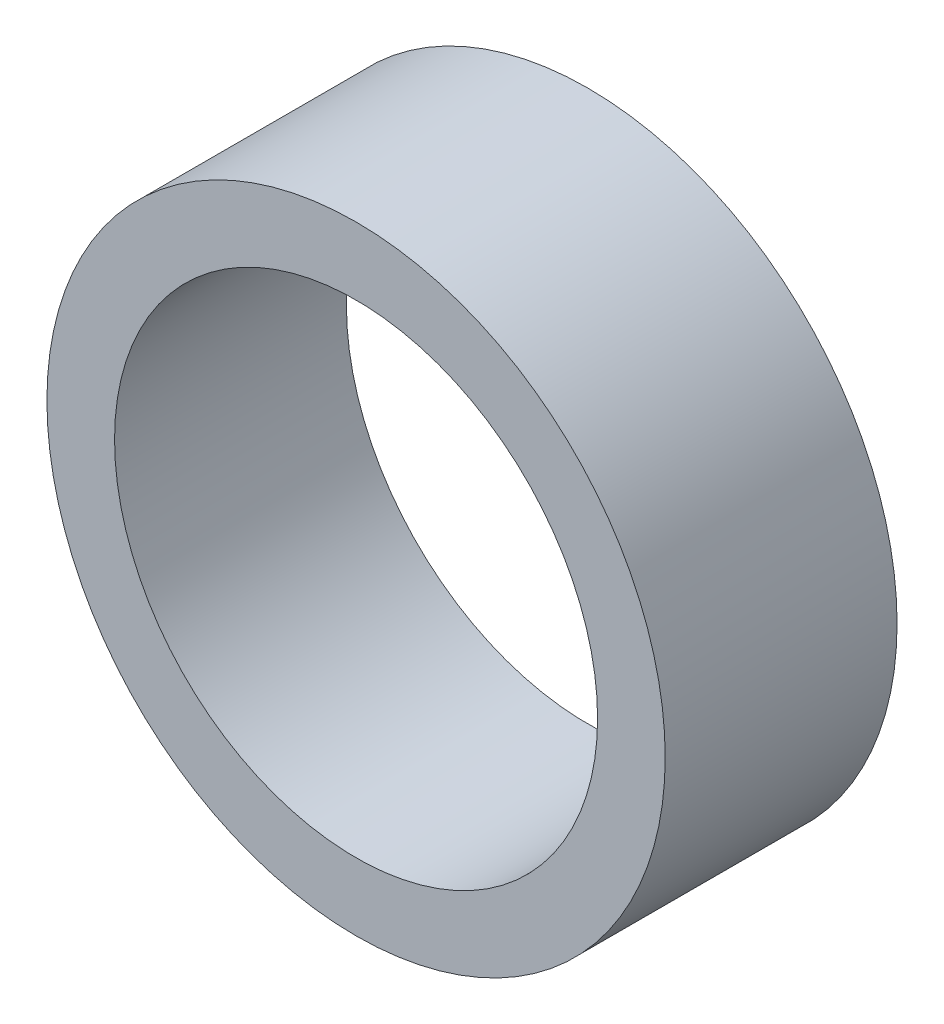
ISO-10303-21;
HEADER;
FILE_DESCRIPTION(('STEP AP214'),'2;1');
FILE_NAME('part.step','',(''),(''),'','','');
FILE_SCHEMA(('AUTOMOTIVE_DESIGN { 1 0 10303 214 1 1 1 1 }'));
ENDSEC;
DATA;
#1=APPLICATION_CONTEXT('core data for automotive mechanical design processes');
#2=APPLICATION_PROTOCOL_DEFINITION('international standard','automotive_design',2000,#1);
#3=PRODUCT_CONTEXT('',#1,'mechanical');
#4=PRODUCT('Part','Part','',(#3));
#5=PRODUCT_RELATED_PRODUCT_CATEGORY('part','',(#4));
#6=PRODUCT_DEFINITION_FORMATION('','',#4);
#7=PRODUCT_DEFINITION_CONTEXT('part definition',#1,'design');
#8=PRODUCT_DEFINITION('design','',#6,#7);
#9=PRODUCT_DEFINITION_SHAPE('','',#8);
#10=(LENGTH_UNIT() NAMED_UNIT(*) SI_UNIT(.MILLI.,.METRE.));
#11=(NAMED_UNIT(*) PLANE_ANGLE_UNIT() SI_UNIT($,.RADIAN.));
#12=(NAMED_UNIT(*) SI_UNIT($,.STERADIAN.) SOLID_ANGLE_UNIT());
#13=UNCERTAINTY_MEASURE_WITH_UNIT(LENGTH_MEASURE(1.E-05),#10,'distance_accuracy_value','');
#14=(GEOMETRIC_REPRESENTATION_CONTEXT(3) GLOBAL_UNCERTAINTY_ASSIGNED_CONTEXT((#13)) GLOBAL_UNIT_ASSIGNED_CONTEXT((#10,
#11,#12)) REPRESENTATION_CONTEXT('',''));
#15=CARTESIAN_POINT('',(0.,0.,0.));
#16=DIRECTION('',(0.,0.,1.));
#17=DIRECTION('',(1.,0.,0.));
#18=AXIS2_PLACEMENT_3D('',#15,#16,#17);
#19=CARTESIAN_POINT('',(0.,0.,12.));
#20=DIRECTION('',(0.,0.,1.));
#21=DIRECTION('',(1.,0.,0.));
#22=AXIS2_PLACEMENT_3D('',#19,#20,#21);
#23=PLANE('',#22);
#24=CARTESIAN_POINT('',(0.,0.,12.));
#25=DIRECTION('',(0.,0.,1.));
#26=DIRECTION('',(1.,0.,0.));
#27=AXIS2_PLACEMENT_3D('',#24,#25,#26);
#28=CIRCLE('',#27,16.);
#29=CARTESIAN_POINT('',(16.,0.,12.));
#30=VERTEX_POINT('',#29);
#31=EDGE_CURVE('E10',#30,#30,#28,.T.);
#32=ORIENTED_EDGE('',*,*,#31,.T.);
#33=EDGE_LOOP('',(#32));
#34=FACE_BOUND('',#33,.T.);
#35=CARTESIAN_POINT('',(0.,0.,12.));
#36=DIRECTION('',(0.,0.,1.));
#37=DIRECTION('',(1.,0.,0.));
#38=AXIS2_PLACEMENT_3D('',#35,#36,#37);
#39=CIRCLE('',#38,12.5);
#40=CARTESIAN_POINT('',(12.5,0.,12.));
#41=VERTEX_POINT('',#40);
#42=EDGE_CURVE('E46',#41,#41,#39,.T.);
#43=ORIENTED_EDGE('',*,*,#42,.F.);
#44=EDGE_LOOP('',(#43));
#45=FACE_BOUND('',#44,.T.);
#46=ADVANCED_FACE('F35',(#34,#45),#23,.T.);
#47=CARTESIAN_POINT('',(0.,0.,0.));
#48=DIRECTION('',(0.,0.,1.));
#49=DIRECTION('',(1.,0.,0.));
#50=AXIS2_PLACEMENT_3D('',#47,#48,#49);
#51=PLANE('',#50);
#52=CARTESIAN_POINT('',(0.,0.,0.));
#53=DIRECTION('',(0.,0.,1.));
#54=DIRECTION('',(1.,0.,0.));
#55=AXIS2_PLACEMENT_3D('',#52,#53,#54);
#56=CIRCLE('',#55,16.);
#57=CARTESIAN_POINT('',(16.,0.,0.));
#58=VERTEX_POINT('',#57);
#59=EDGE_CURVE('E39',#58,#58,#56,.T.);
#60=ORIENTED_EDGE('',*,*,#59,.F.);
#61=EDGE_LOOP('',(#60));
#62=FACE_BOUND('',#61,.T.);
#63=CARTESIAN_POINT('',(0.,0.,0.));
#64=DIRECTION('',(0.,0.,1.));
#65=DIRECTION('',(1.,0.,0.));
#66=AXIS2_PLACEMENT_3D('',#63,#64,#65);
#67=CIRCLE('',#66,12.5);
#68=CARTESIAN_POINT('',(12.5,0.,0.));
#69=VERTEX_POINT('',#68);
#70=EDGE_CURVE('E48',#69,#69,#67,.T.);
#71=ORIENTED_EDGE('',*,*,#70,.T.);
#72=EDGE_LOOP('',(#71));
#73=FACE_BOUND('',#72,.T.);
#74=ADVANCED_FACE('F58',(#62,#73),#51,.F.);
#75=CARTESIAN_POINT('',(0.,0.,12.));
#76=DIRECTION('',(0.,0.,-1.));
#77=DIRECTION('',(-1.,0.,0.));
#78=AXIS2_PLACEMENT_3D('',#75,#76,#77);
#79=CYLINDRICAL_SURFACE('',#78,16.);
#80=ORIENTED_EDGE('',*,*,#31,.F.);
#81=EDGE_LOOP('',(#80));
#82=FACE_BOUND('',#81,.T.);
#83=ORIENTED_EDGE('',*,*,#59,.T.);
#84=EDGE_LOOP('',(#83));
#85=FACE_BOUND('',#84,.T.);
#86=ADVANCED_FACE('F37',(#82,#85),#79,.T.);
#87=CARTESIAN_POINT('',(0.,0.,12.));
#88=DIRECTION('',(0.,0.,-1.));
#89=DIRECTION('',(-1.,0.,0.));
#90=AXIS2_PLACEMENT_3D('',#87,#88,#89);
#91=CYLINDRICAL_SURFACE('',#90,12.5);
#92=ORIENTED_EDGE('',*,*,#42,.T.);
#93=EDGE_LOOP('',(#92));
#94=FACE_BOUND('',#93,.T.);
#95=ORIENTED_EDGE('',*,*,#70,.F.);
#96=EDGE_LOOP('',(#95));
#97=FACE_BOUND('',#96,.T.);
#98=ADVANCED_FACE('F54',(#94,#97),#91,.F.);
#99=CLOSED_SHELL('',(#46,#74,#86,#98));
#100=MANIFOLD_SOLID_BREP('B2',#99);
#101=ADVANCED_BREP_SHAPE_REPRESENTATION('',(#18,#100),#14);
#102=SHAPE_DEFINITION_REPRESENTATION(#9,#101);
ENDSEC;
END-ISO-10303-21;
